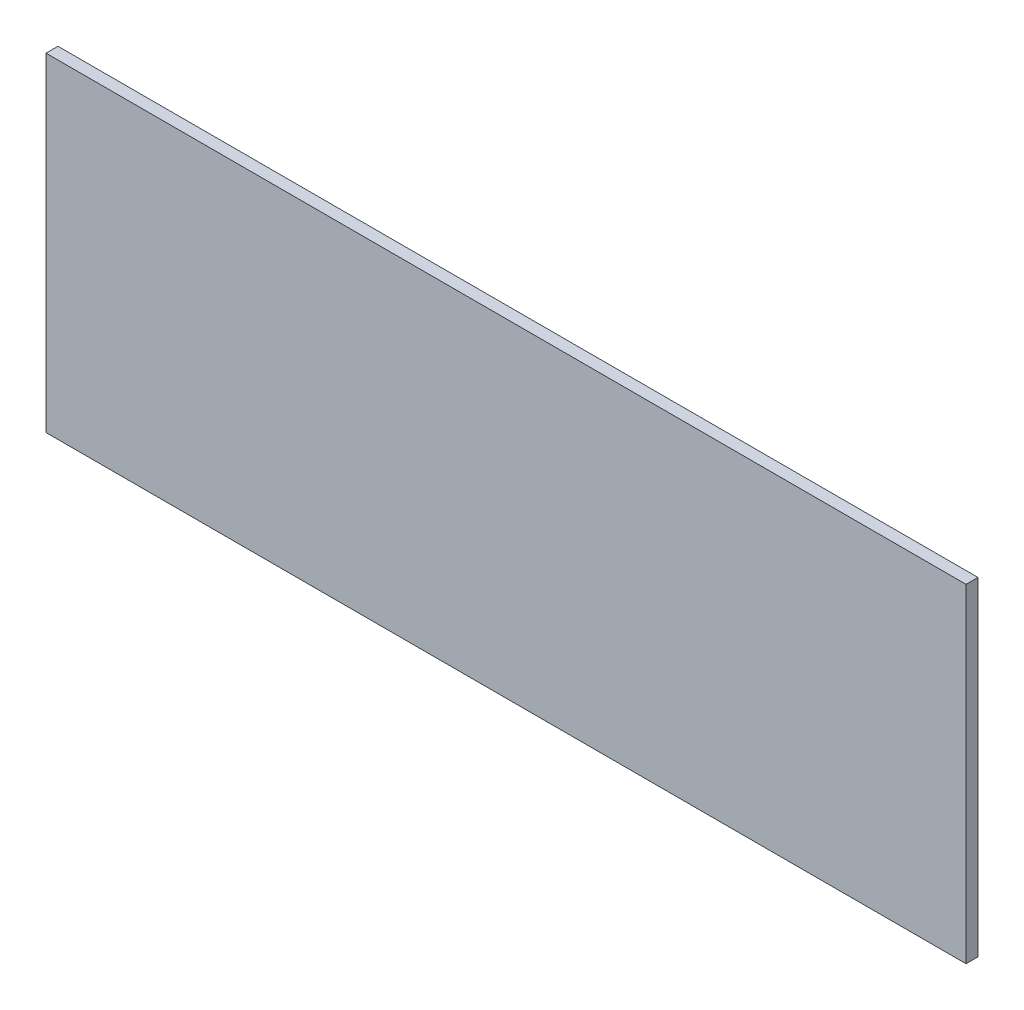
ISO-10303-21;
HEADER;
FILE_DESCRIPTION(('STEP AP214'),'2;1');
FILE_NAME('part.step','',(''),(''),'','','');
FILE_SCHEMA(('AUTOMOTIVE_DESIGN { 1 0 10303 214 1 1 1 1 }'));
ENDSEC;
DATA;
#1=APPLICATION_CONTEXT('core data for automotive mechanical design processes');
#2=APPLICATION_PROTOCOL_DEFINITION('international standard','automotive_design',2000,#1);
#3=PRODUCT_CONTEXT('',#1,'mechanical');
#4=PRODUCT('Part','Part','',(#3));
#5=PRODUCT_RELATED_PRODUCT_CATEGORY('part','',(#4));
#6=PRODUCT_DEFINITION_FORMATION('','',#4);
#7=PRODUCT_DEFINITION_CONTEXT('part definition',#1,'design');
#8=PRODUCT_DEFINITION('design','',#6,#7);
#9=PRODUCT_DEFINITION_SHAPE('','',#8);
#10=(LENGTH_UNIT() NAMED_UNIT(*) SI_UNIT(.MILLI.,.METRE.));
#11=(NAMED_UNIT(*) PLANE_ANGLE_UNIT() SI_UNIT($,.RADIAN.));
#12=(NAMED_UNIT(*) SI_UNIT($,.STERADIAN.) SOLID_ANGLE_UNIT());
#13=UNCERTAINTY_MEASURE_WITH_UNIT(LENGTH_MEASURE(1.E-05),#10,'distance_accuracy_value','');
#14=(GEOMETRIC_REPRESENTATION_CONTEXT(3) GLOBAL_UNCERTAINTY_ASSIGNED_CONTEXT((#13)) GLOBAL_UNIT_ASSIGNED_CONTEXT((#10,
#11,#12)) REPRESENTATION_CONTEXT('',''));
#15=CARTESIAN_POINT('',(0.,0.,0.));
#16=DIRECTION('',(0.,0.,1.));
#17=DIRECTION('',(1.,0.,0.));
#18=AXIS2_PLACEMENT_3D('',#15,#16,#17);
#19=CARTESIAN_POINT('',(0.,0.,2.));
#20=DIRECTION('',(1.,0.,0.));
#21=DIRECTION('',(0.,0.,-1.));
#22=AXIS2_PLACEMENT_3D('',#19,#20,#21);
#23=PLANE('',#22);
#24=DIRECTION('',(0.,-1.,0.));
#25=VECTOR('',#24,1.);
#26=CARTESIAN_POINT('',(0.,0.,0.));
#27=LINE('',#26,#25);
#28=CARTESIAN_POINT('',(0.,55.,0.));
#29=VERTEX_POINT('',#28);
#30=CARTESIAN_POINT('',(0.,0.,0.));
#31=VERTEX_POINT('',#30);
#32=EDGE_CURVE('E108',#29,#31,#27,.T.);
#33=ORIENTED_EDGE('',*,*,#32,.T.);
#34=DIRECTION('',(0.,0.,-1.));
#35=VECTOR('',#34,1.);
#36=CARTESIAN_POINT('',(0.,0.,2.));
#37=LINE('',#36,#35);
#38=CARTESIAN_POINT('',(0.,0.,2.));
#39=VERTEX_POINT('',#38);
#40=EDGE_CURVE('E11',#39,#31,#37,.T.);
#41=ORIENTED_EDGE('',*,*,#40,.F.);
#42=DIRECTION('',(0.,-1.,0.));
#43=VECTOR('',#42,1.);
#44=CARTESIAN_POINT('',(0.,0.,2.));
#45=LINE('',#44,#43);
#46=CARTESIAN_POINT('',(0.,55.,2.));
#47=VERTEX_POINT('',#46);
#48=EDGE_CURVE('E92',#47,#39,#45,.T.);
#49=ORIENTED_EDGE('',*,*,#48,.F.);
#50=DIRECTION('',(0.,0.,-1.));
#51=VECTOR('',#50,1.);
#52=CARTESIAN_POINT('',(0.,55.,2.));
#53=LINE('',#52,#51);
#54=EDGE_CURVE('E105',#47,#29,#53,.T.);
#55=ORIENTED_EDGE('',*,*,#54,.T.);
#56=EDGE_LOOP('',(#33,#41,#49,#55));
#57=FACE_BOUND('',#56,.T.);
#58=ADVANCED_FACE('F43',(#57),#23,.F.);
#59=CARTESIAN_POINT('',(0.,0.,2.));
#60=DIRECTION('',(0.,1.,0.));
#61=DIRECTION('',(0.,0.,1.));
#62=AXIS2_PLACEMENT_3D('',#59,#60,#61);
#63=PLANE('',#62);
#64=DIRECTION('',(1.,0.,0.));
#65=VECTOR('',#64,1.);
#66=CARTESIAN_POINT('',(0.,0.,0.));
#67=LINE('',#66,#65);
#68=CARTESIAN_POINT('',(154.,0.,0.));
#69=VERTEX_POINT('',#68);
#70=EDGE_CURVE('E97',#31,#69,#67,.T.);
#71=ORIENTED_EDGE('',*,*,#70,.T.);
#72=DIRECTION('',(0.,0.,-1.));
#73=VECTOR('',#72,1.);
#74=CARTESIAN_POINT('',(154.,0.,2.));
#75=LINE('',#74,#73);
#76=CARTESIAN_POINT('',(154.,0.,2.));
#77=VERTEX_POINT('',#76);
#78=EDGE_CURVE('E51',#77,#69,#75,.T.);
#79=ORIENTED_EDGE('',*,*,#78,.F.);
#80=DIRECTION('',(1.,0.,0.));
#81=VECTOR('',#80,1.);
#82=CARTESIAN_POINT('',(0.,0.,2.));
#83=LINE('',#82,#81);
#84=EDGE_CURVE('E87',#39,#77,#83,.T.);
#85=ORIENTED_EDGE('',*,*,#84,.F.);
#86=ORIENTED_EDGE('',*,*,#40,.T.);
#87=EDGE_LOOP('',(#71,#79,#85,#86));
#88=FACE_BOUND('',#87,.T.);
#89=ADVANCED_FACE('F100',(#88),#63,.F.);
#90=CARTESIAN_POINT('',(154.,0.,2.));
#91=DIRECTION('',(-1.,0.,0.));
#92=DIRECTION('',(0.,0.,1.));
#93=AXIS2_PLACEMENT_3D('',#90,#91,#92);
#94=PLANE('',#93);
#95=DIRECTION('',(0.,1.,0.));
#96=VECTOR('',#95,1.);
#97=CARTESIAN_POINT('',(154.,0.,0.));
#98=LINE('',#97,#96);
#99=CARTESIAN_POINT('',(154.,55.,0.));
#100=VERTEX_POINT('',#99);
#101=EDGE_CURVE('E78',#69,#100,#98,.T.);
#102=ORIENTED_EDGE('',*,*,#101,.T.);
#103=DIRECTION('',(0.,0.,-1.));
#104=VECTOR('',#103,1.);
#105=CARTESIAN_POINT('',(154.,55.,2.));
#106=LINE('',#105,#104);
#107=CARTESIAN_POINT('',(154.,55.,2.));
#108=VERTEX_POINT('',#107);
#109=EDGE_CURVE('E98',#108,#100,#106,.T.);
#110=ORIENTED_EDGE('',*,*,#109,.F.);
#111=DIRECTION('',(0.,1.,0.));
#112=VECTOR('',#111,1.);
#113=CARTESIAN_POINT('',(154.,0.,2.));
#114=LINE('',#113,#112);
#115=EDGE_CURVE('E95',#77,#108,#114,.T.);
#116=ORIENTED_EDGE('',*,*,#115,.F.);
#117=ORIENTED_EDGE('',*,*,#78,.T.);
#118=EDGE_LOOP('',(#102,#110,#116,#117));
#119=FACE_BOUND('',#118,.T.);
#120=ADVANCED_FACE('F99',(#119),#94,.F.);
#121=CARTESIAN_POINT('',(0.,55.,2.));
#122=DIRECTION('',(0.,-1.,0.));
#123=DIRECTION('',(0.,0.,-1.));
#124=AXIS2_PLACEMENT_3D('',#121,#122,#123);
#125=PLANE('',#124);
#126=DIRECTION('',(-1.,0.,0.));
#127=VECTOR('',#126,1.);
#128=CARTESIAN_POINT('',(0.,55.,0.));
#129=LINE('',#128,#127);
#130=EDGE_CURVE('E85',#100,#29,#129,.T.);
#131=ORIENTED_EDGE('',*,*,#130,.T.);
#132=ORIENTED_EDGE('',*,*,#54,.F.);
#133=DIRECTION('',(-1.,0.,0.));
#134=VECTOR('',#133,1.);
#135=CARTESIAN_POINT('',(0.,55.,2.));
#136=LINE('',#135,#134);
#137=EDGE_CURVE('E56',#108,#47,#136,.T.);
#138=ORIENTED_EDGE('',*,*,#137,.F.);
#139=ORIENTED_EDGE('',*,*,#109,.T.);
#140=EDGE_LOOP('',(#131,#132,#138,#139));
#141=FACE_BOUND('',#140,.T.);
#142=ADVANCED_FACE('F111',(#141),#125,.F.);
#143=CARTESIAN_POINT('',(0.,0.,2.));
#144=DIRECTION('',(0.,0.,-1.));
#145=DIRECTION('',(-1.,0.,0.));
#146=AXIS2_PLACEMENT_3D('',#143,#144,#145);
#147=PLANE('',#146);
#148=ORIENTED_EDGE('',*,*,#48,.T.);
#149=ORIENTED_EDGE('',*,*,#84,.T.);
#150=ORIENTED_EDGE('',*,*,#115,.T.);
#151=ORIENTED_EDGE('',*,*,#137,.T.);
#152=EDGE_LOOP('',(#148,#149,#150,#151));
#153=FACE_BOUND('',#152,.T.);
#154=ADVANCED_FACE('F89',(#153),#147,.F.);
#155=CARTESIAN_POINT('',(0.,0.,0.));
#156=DIRECTION('',(0.,0.,-1.));
#157=DIRECTION('',(-1.,0.,0.));
#158=AXIS2_PLACEMENT_3D('',#155,#156,#157);
#159=PLANE('',#158);
#160=ORIENTED_EDGE('',*,*,#32,.F.);
#161=ORIENTED_EDGE('',*,*,#130,.F.);
#162=ORIENTED_EDGE('',*,*,#101,.F.);
#163=ORIENTED_EDGE('',*,*,#70,.F.);
#164=EDGE_LOOP('',(#160,#161,#162,#163));
#165=FACE_BOUND('',#164,.T.);
#166=ADVANCED_FACE('F116',(#165),#159,.T.);
#167=CLOSED_SHELL('',(#58,#89,#120,#142,#154,#166));
#168=MANIFOLD_SOLID_BREP('B2',#167);
#169=ADVANCED_BREP_SHAPE_REPRESENTATION('',(#18,#168),#14);
#170=SHAPE_DEFINITION_REPRESENTATION(#9,#169);
ENDSEC;
END-ISO-10303-21;
